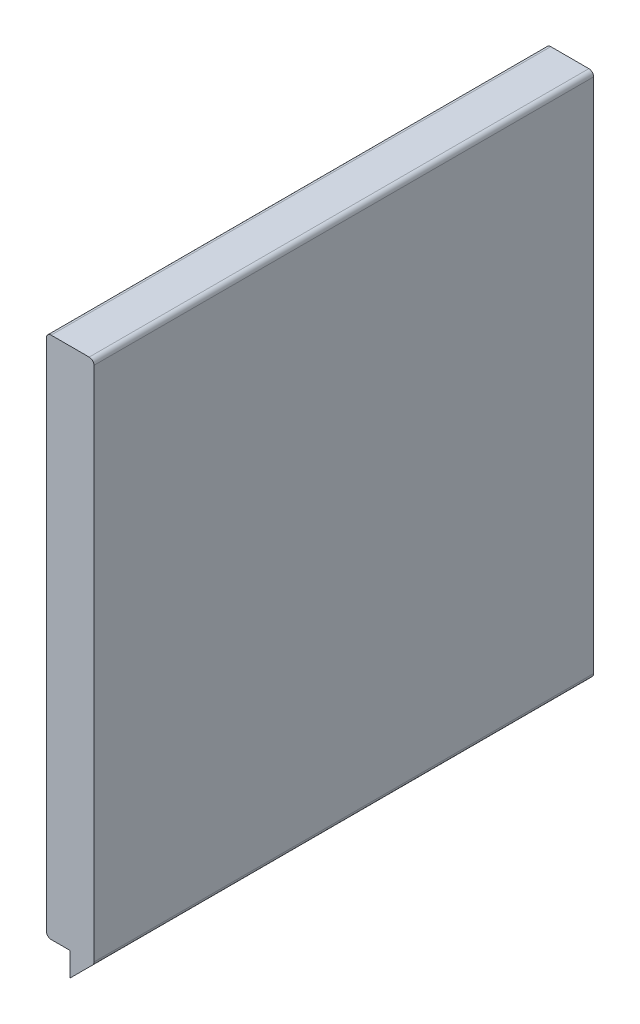
ISO-10303-21;
HEADER;
FILE_DESCRIPTION(('STEP AP214'),'2;1');
FILE_NAME('part.step','',(''),(''),'','','');
FILE_SCHEMA(('AUTOMOTIVE_DESIGN { 1 0 10303 214 1 1 1 1 }'));
ENDSEC;
DATA;
#1=APPLICATION_CONTEXT('core data for automotive mechanical design processes');
#2=APPLICATION_PROTOCOL_DEFINITION('international standard','automotive_design',2000,#1);
#3=PRODUCT_CONTEXT('',#1,'mechanical');
#4=PRODUCT('Part','Part','',(#3));
#5=PRODUCT_RELATED_PRODUCT_CATEGORY('part','',(#4));
#6=PRODUCT_DEFINITION_FORMATION('','',#4);
#7=PRODUCT_DEFINITION_CONTEXT('part definition',#1,'design');
#8=PRODUCT_DEFINITION('design','',#6,#7);
#9=PRODUCT_DEFINITION_SHAPE('','',#8);
#10=(LENGTH_UNIT() NAMED_UNIT(*) SI_UNIT(.MILLI.,.METRE.));
#11=(NAMED_UNIT(*) PLANE_ANGLE_UNIT() SI_UNIT($,.RADIAN.));
#12=(NAMED_UNIT(*) SI_UNIT($,.STERADIAN.) SOLID_ANGLE_UNIT());
#13=UNCERTAINTY_MEASURE_WITH_UNIT(LENGTH_MEASURE(1.E-05),#10,'distance_accuracy_value','');
#14=(GEOMETRIC_REPRESENTATION_CONTEXT(3) GLOBAL_UNCERTAINTY_ASSIGNED_CONTEXT((#13)) GLOBAL_UNIT_ASSIGNED_CONTEXT((#10,
#11,#12)) REPRESENTATION_CONTEXT('',''));
#15=CARTESIAN_POINT('',(0.,0.,0.));
#16=DIRECTION('',(0.,0.,1.));
#17=DIRECTION('',(1.,0.,0.));
#18=AXIS2_PLACEMENT_3D('',#15,#16,#17);
#19=CARTESIAN_POINT('',(10.,-55.,52.5));
#20=DIRECTION('',(-1.,0.,0.));
#21=DIRECTION('',(0.,-1.,0.));
#22=AXIS2_PLACEMENT_3D('',#19,#20,#21);
#23=PLANE('',#22);
#24=DIRECTION('',(0.,1.,0.));
#25=VECTOR('',#24,1.);
#26=CARTESIAN_POINT('',(10.,-55.,-52.5));
#27=LINE('',#26,#25);
#28=CARTESIAN_POINT('',(10.,-54.5857864376269,-52.5));
#29=VERTEX_POINT('',#28);
#30=CARTESIAN_POINT('',(10.,54.,-52.5));
#31=VERTEX_POINT('',#30);
#32=EDGE_CURVE('E149',#29,#31,#27,.T.);
#33=ORIENTED_EDGE('',*,*,#32,.T.);
#34=DIRECTION('',(0.,0.,-1.));
#35=VECTOR('',#34,1.);
#36=CARTESIAN_POINT('',(10.,54.,52.5));
#37=LINE('',#36,#35);
#38=CARTESIAN_POINT('',(10.,54.,52.5));
#39=VERTEX_POINT('',#38);
#40=EDGE_CURVE('E194',#31,#39,#37,.F.);
#41=ORIENTED_EDGE('',*,*,#40,.T.);
#42=DIRECTION('',(0.,1.,0.));
#43=VECTOR('',#42,1.);
#44=CARTESIAN_POINT('',(10.,-55.,52.5));
#45=LINE('',#44,#43);
#46=CARTESIAN_POINT('',(10.,-54.5857864376269,52.5));
#47=VERTEX_POINT('',#46);
#48=EDGE_CURVE('E169',#47,#39,#45,.T.);
#49=ORIENTED_EDGE('',*,*,#48,.F.);
#50=DIRECTION('',(0.,0.,-1.));
#51=VECTOR('',#50,1.);
#52=CARTESIAN_POINT('',(10.,-54.5857864376269,52.5));
#53=LINE('',#52,#51);
#54=EDGE_CURVE('E190',#47,#29,#53,.T.);
#55=ORIENTED_EDGE('',*,*,#54,.T.);
#56=EDGE_LOOP('',(#33,#41,#49,#55));
#57=FACE_BOUND('',#56,.T.);
#58=ADVANCED_FACE('F39',(#57),#23,.F.);
#59=CARTESIAN_POINT('',(10.,55.,52.5));
#60=DIRECTION('',(0.,-1.,0.));
#61=DIRECTION('',(0.,0.,-1.));
#62=AXIS2_PLACEMENT_3D('',#59,#60,#61);
#63=PLANE('',#62);
#64=DIRECTION('',(-1.,0.,0.));
#65=VECTOR('',#64,1.);
#66=CARTESIAN_POINT('',(10.,55.,52.5));
#67=LINE('',#66,#65);
#68=CARTESIAN_POINT('',(9.00000000000001,55.,52.5));
#69=VERTEX_POINT('',#68);
#70=CARTESIAN_POINT('',(0.999999999999975,55.,52.5));
#71=VERTEX_POINT('',#70);
#72=EDGE_CURVE('E228',#69,#71,#67,.T.);
#73=ORIENTED_EDGE('',*,*,#72,.F.);
#74=DIRECTION('',(0.,0.,-1.));
#75=VECTOR('',#74,1.);
#76=CARTESIAN_POINT('',(9.00000000000001,55.,52.5));
#77=LINE('',#76,#75);
#78=CARTESIAN_POINT('',(9.00000000000001,55.,-52.5));
#79=VERTEX_POINT('',#78);
#80=EDGE_CURVE('E174',#69,#79,#77,.T.);
#81=ORIENTED_EDGE('',*,*,#80,.T.);
#82=DIRECTION('',(-1.,0.,0.));
#83=VECTOR('',#82,1.);
#84=CARTESIAN_POINT('',(10.,55.,-52.5));
#85=LINE('',#84,#83);
#86=CARTESIAN_POINT('',(0.999999999999975,55.,-52.5));
#87=VERTEX_POINT('',#86);
#88=EDGE_CURVE('E153',#79,#87,#85,.T.);
#89=ORIENTED_EDGE('',*,*,#88,.T.);
#90=DIRECTION('',(0.,0.,-1.));
#91=VECTOR('',#90,1.);
#92=CARTESIAN_POINT('',(0.999999999999975,55.,52.5));
#93=LINE('',#92,#91);
#94=EDGE_CURVE('E137',#87,#71,#93,.F.);
#95=ORIENTED_EDGE('',*,*,#94,.T.);
#96=EDGE_LOOP('',(#73,#81,#89,#95));
#97=FACE_BOUND('',#96,.T.);
#98=ADVANCED_FACE('F244',(#97),#63,.F.);
#99=CARTESIAN_POINT('',(0.,55.,52.5));
#100=DIRECTION('',(1.,0.,0.));
#101=DIRECTION('',(0.,1.,0.));
#102=AXIS2_PLACEMENT_3D('',#99,#100,#101);
#103=PLANE('',#102);
#104=DIRECTION('',(0.,-1.,0.));
#105=VECTOR('',#104,1.);
#106=CARTESIAN_POINT('',(0.,55.,52.5));
#107=LINE('',#106,#105);
#108=CARTESIAN_POINT('',(0.,54.,52.5));
#109=VERTEX_POINT('',#108);
#110=CARTESIAN_POINT('',(0.,-54.,52.5));
#111=VERTEX_POINT('',#110);
#112=EDGE_CURVE('E127',#109,#111,#107,.T.);
#113=ORIENTED_EDGE('',*,*,#112,.F.);
#114=DIRECTION('',(0.,0.,-1.));
#115=VECTOR('',#114,1.);
#116=CARTESIAN_POINT('',(0.,54.,52.5));
#117=LINE('',#116,#115);
#118=CARTESIAN_POINT('',(0.,54.,-52.5));
#119=VERTEX_POINT('',#118);
#120=EDGE_CURVE('E48',#109,#119,#117,.T.);
#121=ORIENTED_EDGE('',*,*,#120,.T.);
#122=DIRECTION('',(0.,-1.,0.));
#123=VECTOR('',#122,1.);
#124=CARTESIAN_POINT('',(0.,55.,-52.5));
#125=LINE('',#124,#123);
#126=CARTESIAN_POINT('',(0.,-54.,-52.5));
#127=VERTEX_POINT('',#126);
#128=EDGE_CURVE('E157',#119,#127,#125,.T.);
#129=ORIENTED_EDGE('',*,*,#128,.T.);
#130=DIRECTION('',(0.,0.,-1.));
#131=VECTOR('',#130,1.);
#132=CARTESIAN_POINT('',(0.,-54.,52.5));
#133=LINE('',#132,#131);
#134=EDGE_CURVE('E210',#127,#111,#133,.F.);
#135=ORIENTED_EDGE('',*,*,#134,.T.);
#136=EDGE_LOOP('',(#113,#121,#129,#135));
#137=FACE_BOUND('',#136,.T.);
#138=ADVANCED_FACE('F218',(#137),#103,.F.);
#139=CARTESIAN_POINT('',(0.,-55.,52.5));
#140=DIRECTION('',(0.,1.,0.));
#141=DIRECTION('',(0.,0.,1.));
#142=AXIS2_PLACEMENT_3D('',#139,#140,#141);
#143=PLANE('',#142);
#144=DIRECTION('',(1.,0.,0.));
#145=VECTOR('',#144,1.);
#146=CARTESIAN_POINT('',(0.,-55.,52.5));
#147=LINE('',#146,#145);
#148=CARTESIAN_POINT('',(1.00000000000001,-55.,52.5));
#149=VERTEX_POINT('',#148);
#150=CARTESIAN_POINT('',(5.00000000000001,-55.,52.5));
#151=VERTEX_POINT('',#150);
#152=EDGE_CURVE('E117',#149,#151,#147,.T.);
#153=ORIENTED_EDGE('',*,*,#152,.F.);
#154=DIRECTION('',(0.,0.,-1.));
#155=VECTOR('',#154,1.);
#156=CARTESIAN_POINT('',(1.00000000000001,-55.,52.5));
#157=LINE('',#156,#155);
#158=CARTESIAN_POINT('',(1.00000000000001,-55.,-52.5));
#159=VERTEX_POINT('',#158);
#160=EDGE_CURVE('E11',#149,#159,#157,.T.);
#161=ORIENTED_EDGE('',*,*,#160,.T.);
#162=DIRECTION('',(1.,0.,0.));
#163=VECTOR('',#162,1.);
#164=CARTESIAN_POINT('',(0.,-55.,-52.5));
#165=LINE('',#164,#163);
#166=CARTESIAN_POINT('',(5.00000000000001,-55.,-52.5));
#167=VERTEX_POINT('',#166);
#168=EDGE_CURVE('E133',#159,#167,#165,.T.);
#169=ORIENTED_EDGE('',*,*,#168,.T.);
#170=DIRECTION('',(0.,0.,-1.));
#171=VECTOR('',#170,1.);
#172=CARTESIAN_POINT('',(5.00000000000001,-55.,52.5));
#173=LINE('',#172,#171);
#174=EDGE_CURVE('E130',#151,#167,#173,.T.);
#175=ORIENTED_EDGE('',*,*,#174,.F.);
#176=EDGE_LOOP('',(#153,#161,#169,#175));
#177=FACE_BOUND('',#176,.T.);
#178=ADVANCED_FACE('F131',(#177),#143,.F.);
#179=CARTESIAN_POINT('',(5.00000000000001,-55.,52.5));
#180=DIRECTION('',(1.,0.,0.));
#181=DIRECTION('',(0.,1.,0.));
#182=AXIS2_PLACEMENT_3D('',#179,#180,#181);
#183=PLANE('',#182);
#184=DIRECTION('',(0.,-1.,0.));
#185=VECTOR('',#184,1.);
#186=CARTESIAN_POINT('',(5.00000000000001,-55.,-52.5));
#187=LINE('',#186,#185);
#188=CARTESIAN_POINT('',(5.00000000000001,-60.,-52.5));
#189=VERTEX_POINT('',#188);
#190=EDGE_CURVE('E163',#167,#189,#187,.T.);
#191=ORIENTED_EDGE('',*,*,#190,.T.);
#192=DIRECTION('',(0.,0.,-1.));
#193=VECTOR('',#192,1.);
#194=CARTESIAN_POINT('',(5.00000000000001,-60.,52.5));
#195=LINE('',#194,#193);
#196=CARTESIAN_POINT('',(5.00000000000001,-60.,52.5));
#197=VERTEX_POINT('',#196);
#198=EDGE_CURVE('E138',#197,#189,#195,.T.);
#199=ORIENTED_EDGE('',*,*,#198,.F.);
#200=DIRECTION('',(0.,-1.,0.));
#201=VECTOR('',#200,1.);
#202=CARTESIAN_POINT('',(5.00000000000001,-55.,52.5));
#203=LINE('',#202,#201);
#204=EDGE_CURVE('E122',#151,#197,#203,.T.);
#205=ORIENTED_EDGE('',*,*,#204,.F.);
#206=ORIENTED_EDGE('',*,*,#174,.T.);
#207=EDGE_LOOP('',(#191,#199,#205,#206));
#208=FACE_BOUND('',#207,.T.);
#209=ADVANCED_FACE('F140',(#208),#183,.F.);
#210=CARTESIAN_POINT('',(5.00000000000001,-60.,52.5));
#211=DIRECTION('',(-0.707106781186546,0.707106781186549,0.));
#212=DIRECTION('',(-0.707106781186549,-0.707106781186546,0.));
#213=AXIS2_PLACEMENT_3D('',#210,#211,#212);
#214=PLANE('',#213);
#215=DIRECTION('',(0.707106781186549,0.707106781186546,0.));
#216=VECTOR('',#215,1.);
#217=CARTESIAN_POINT('',(5.00000000000001,-60.,-52.5));
#218=LINE('',#217,#216);
#219=CARTESIAN_POINT('',(9.70710678118655,-55.2928932188135,-52.5));
#220=VERTEX_POINT('',#219);
#221=EDGE_CURVE('E166',#189,#220,#218,.T.);
#222=ORIENTED_EDGE('',*,*,#221,.T.);
#223=DIRECTION('',(0.,0.,-1.));
#224=VECTOR('',#223,1.);
#225=CARTESIAN_POINT('',(9.70710678118655,-55.2928932188135,52.5));
#226=LINE('',#225,#224);
#227=CARTESIAN_POINT('',(9.70710678118655,-55.2928932188135,52.5));
#228=VERTEX_POINT('',#227);
#229=EDGE_CURVE('E55',#220,#228,#226,.F.);
#230=ORIENTED_EDGE('',*,*,#229,.T.);
#231=DIRECTION('',(0.707106781186549,0.707106781186546,0.));
#232=VECTOR('',#231,1.);
#233=CARTESIAN_POINT('',(5.00000000000001,-60.,52.5));
#234=LINE('',#233,#232);
#235=EDGE_CURVE('E143',#197,#228,#234,.T.);
#236=ORIENTED_EDGE('',*,*,#235,.F.);
#237=ORIENTED_EDGE('',*,*,#198,.T.);
#238=EDGE_LOOP('',(#222,#230,#236,#237));
#239=FACE_BOUND('',#238,.T.);
#240=ADVANCED_FACE('F250',(#239),#214,.F.);
#241=CARTESIAN_POINT('',(0.,0.,52.5));
#242=DIRECTION('',(0.,0.,1.));
#243=DIRECTION('',(1.,0.,0.));
#244=AXIS2_PLACEMENT_3D('',#241,#242,#243);
#245=PLANE('',#244);
#246=ORIENTED_EDGE('',*,*,#48,.T.);
#247=CARTESIAN_POINT('',(9.00000000000001,54.,52.5));
#248=DIRECTION('',(0.,0.,1.));
#249=DIRECTION('',(1.,0.,0.));
#250=AXIS2_PLACEMENT_3D('',#247,#248,#249);
#251=CIRCLE('',#250,1.);
#252=EDGE_CURVE('E205',#39,#69,#251,.T.);
#253=ORIENTED_EDGE('',*,*,#252,.T.);
#254=ORIENTED_EDGE('',*,*,#72,.T.);
#255=CARTESIAN_POINT('',(0.999999999999975,54.,52.5));
#256=DIRECTION('',(0.,0.,1.));
#257=DIRECTION('',(1.,0.,0.));
#258=AXIS2_PLACEMENT_3D('',#255,#256,#257);
#259=CIRCLE('',#258,1.);
#260=EDGE_CURVE('E199',#71,#109,#259,.T.);
#261=ORIENTED_EDGE('',*,*,#260,.T.);
#262=ORIENTED_EDGE('',*,*,#112,.T.);
#263=CARTESIAN_POINT('',(1.00000000000001,-54.,52.5));
#264=DIRECTION('',(0.,0.,1.));
#265=DIRECTION('',(1.,0.,0.));
#266=AXIS2_PLACEMENT_3D('',#263,#264,#265);
#267=CIRCLE('',#266,1.);
#268=EDGE_CURVE('E63',#111,#149,#267,.T.);
#269=ORIENTED_EDGE('',*,*,#268,.T.);
#270=ORIENTED_EDGE('',*,*,#152,.T.);
#271=ORIENTED_EDGE('',*,*,#204,.T.);
#272=ORIENTED_EDGE('',*,*,#235,.T.);
#273=CARTESIAN_POINT('',(9.00000000000001,-54.5857864376269,52.5));
#274=DIRECTION('',(0.,0.,1.));
#275=DIRECTION('',(1.,0.,0.));
#276=AXIS2_PLACEMENT_3D('',#273,#274,#275);
#277=CIRCLE('',#276,1.);
#278=EDGE_CURVE('E202',#228,#47,#277,.T.);
#279=ORIENTED_EDGE('',*,*,#278,.T.);
#280=EDGE_LOOP('',(#246,#253,#254,#261,#262,#269,#270,#271,#272,#279));
#281=FACE_BOUND('',#280,.T.);
#282=ADVANCED_FACE('F120',(#281),#245,.T.);
#283=CARTESIAN_POINT('',(0.,0.,-52.5));
#284=DIRECTION('',(0.,0.,1.));
#285=DIRECTION('',(1.,0.,0.));
#286=AXIS2_PLACEMENT_3D('',#283,#284,#285);
#287=PLANE('',#286);
#288=ORIENTED_EDGE('',*,*,#88,.F.);
#289=CARTESIAN_POINT('',(9.00000000000001,54.,-52.5));
#290=DIRECTION('',(0.,0.,1.));
#291=DIRECTION('',(1.,0.,0.));
#292=AXIS2_PLACEMENT_3D('',#289,#290,#291);
#293=CIRCLE('',#292,1.);
#294=EDGE_CURVE('E187',#79,#31,#293,.F.);
#295=ORIENTED_EDGE('',*,*,#294,.T.);
#296=ORIENTED_EDGE('',*,*,#32,.F.);
#297=CARTESIAN_POINT('',(9.00000000000001,-54.5857864376269,-52.5));
#298=DIRECTION('',(0.,0.,1.));
#299=DIRECTION('',(1.,0.,0.));
#300=AXIS2_PLACEMENT_3D('',#297,#298,#299);
#301=CIRCLE('',#300,1.);
#302=EDGE_CURVE('E184',#29,#220,#301,.F.);
#303=ORIENTED_EDGE('',*,*,#302,.T.);
#304=ORIENTED_EDGE('',*,*,#221,.F.);
#305=ORIENTED_EDGE('',*,*,#190,.F.);
#306=ORIENTED_EDGE('',*,*,#168,.F.);
#307=CARTESIAN_POINT('',(1.00000000000001,-54.,-52.5));
#308=DIRECTION('',(0.,0.,1.));
#309=DIRECTION('',(1.,0.,0.));
#310=AXIS2_PLACEMENT_3D('',#307,#308,#309);
#311=CIRCLE('',#310,1.);
#312=EDGE_CURVE('E178',#159,#127,#311,.F.);
#313=ORIENTED_EDGE('',*,*,#312,.T.);
#314=ORIENTED_EDGE('',*,*,#128,.F.);
#315=CARTESIAN_POINT('',(0.999999999999975,54.,-52.5));
#316=DIRECTION('',(0.,0.,1.));
#317=DIRECTION('',(1.,0.,0.));
#318=AXIS2_PLACEMENT_3D('',#315,#316,#317);
#319=CIRCLE('',#318,1.);
#320=EDGE_CURVE('E181',#119,#87,#319,.F.);
#321=ORIENTED_EDGE('',*,*,#320,.T.);
#322=EDGE_LOOP('',(#288,#295,#296,#303,#304,#305,#306,#313,#314,#321));
#323=FACE_BOUND('',#322,.T.);
#324=ADVANCED_FACE('F224',(#323),#287,.F.);
#325=CARTESIAN_POINT('',(9.00000000000001,54.,52.5));
#326=DIRECTION('',(0.,0.,-1.));
#327=DIRECTION('',(-1.,0.,0.));
#328=AXIS2_PLACEMENT_3D('',#325,#326,#327);
#329=CYLINDRICAL_SURFACE('',#328,1.);
#330=ORIENTED_EDGE('',*,*,#252,.F.);
#331=ORIENTED_EDGE('',*,*,#40,.F.);
#332=ORIENTED_EDGE('',*,*,#294,.F.);
#333=ORIENTED_EDGE('',*,*,#80,.F.);
#334=EDGE_LOOP('',(#330,#331,#332,#333));
#335=FACE_BOUND('',#334,.T.);
#336=ADVANCED_FACE('F242',(#335),#329,.T.);
#337=CARTESIAN_POINT('',(9.00000000000001,-54.5857864376269,52.5));
#338=DIRECTION('',(0.,0.,-1.));
#339=DIRECTION('',(-1.,0.,0.));
#340=AXIS2_PLACEMENT_3D('',#337,#338,#339);
#341=CYLINDRICAL_SURFACE('',#340,1.);
#342=ORIENTED_EDGE('',*,*,#278,.F.);
#343=ORIENTED_EDGE('',*,*,#229,.F.);
#344=ORIENTED_EDGE('',*,*,#302,.F.);
#345=ORIENTED_EDGE('',*,*,#54,.F.);
#346=EDGE_LOOP('',(#342,#343,#344,#345));
#347=FACE_BOUND('',#346,.T.);
#348=ADVANCED_FACE('F248',(#347),#341,.T.);
#349=CARTESIAN_POINT('',(0.999999999999975,54.,52.5));
#350=DIRECTION('',(0.,0.,-1.));
#351=DIRECTION('',(-1.,0.,0.));
#352=AXIS2_PLACEMENT_3D('',#349,#350,#351);
#353=CYLINDRICAL_SURFACE('',#352,1.);
#354=ORIENTED_EDGE('',*,*,#260,.F.);
#355=ORIENTED_EDGE('',*,*,#94,.F.);
#356=ORIENTED_EDGE('',*,*,#320,.F.);
#357=ORIENTED_EDGE('',*,*,#120,.F.);
#358=EDGE_LOOP('',(#354,#355,#356,#357));
#359=FACE_BOUND('',#358,.T.);
#360=ADVANCED_FACE('F271',(#359),#353,.T.);
#361=CARTESIAN_POINT('',(1.00000000000001,-54.,52.5));
#362=DIRECTION('',(0.,0.,-1.));
#363=DIRECTION('',(-1.,0.,0.));
#364=AXIS2_PLACEMENT_3D('',#361,#362,#363);
#365=CYLINDRICAL_SURFACE('',#364,1.);
#366=ORIENTED_EDGE('',*,*,#268,.F.);
#367=ORIENTED_EDGE('',*,*,#134,.F.);
#368=ORIENTED_EDGE('',*,*,#312,.F.);
#369=ORIENTED_EDGE('',*,*,#160,.F.);
#370=EDGE_LOOP('',(#366,#367,#368,#369));
#371=FACE_BOUND('',#370,.T.);
#372=ADVANCED_FACE('F41',(#371),#365,.T.);
#373=CLOSED_SHELL('',(#58,#98,#138,#178,#209,#240,#282,#324,#336,#348,#360,#372));
#374=MANIFOLD_SOLID_BREP('B2',#373);
#375=ADVANCED_BREP_SHAPE_REPRESENTATION('',(#18,#374),#14);
#376=SHAPE_DEFINITION_REPRESENTATION(#9,#375);
ENDSEC;
END-ISO-10303-21;
